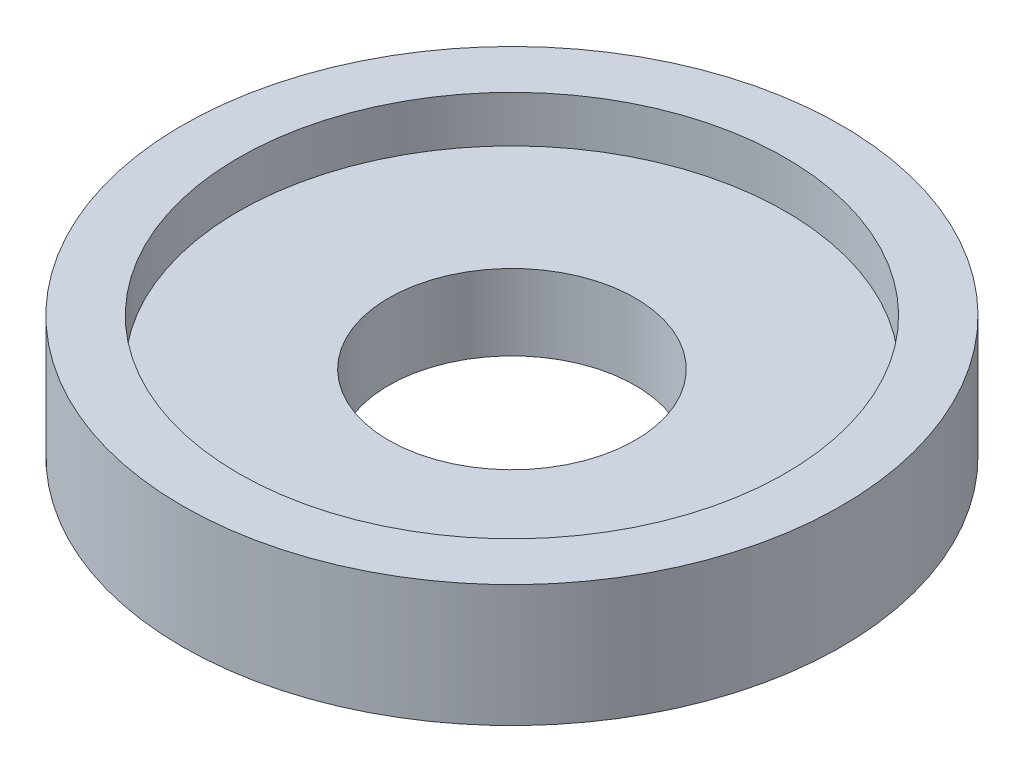
ISO-10303-21;
HEADER;
FILE_DESCRIPTION(('STEP AP214'),'2;1');
FILE_NAME('part.step','',(''),(''),'','','');
FILE_SCHEMA(('AUTOMOTIVE_DESIGN { 1 0 10303 214 1 1 1 1 }'));
ENDSEC;
DATA;
#1=APPLICATION_CONTEXT('core data for automotive mechanical design processes');
#2=APPLICATION_PROTOCOL_DEFINITION('international standard','automotive_design',2000,#1);
#3=PRODUCT_CONTEXT('',#1,'mechanical');
#4=PRODUCT('Part','Part','',(#3));
#5=PRODUCT_RELATED_PRODUCT_CATEGORY('part','',(#4));
#6=PRODUCT_DEFINITION_FORMATION('','',#4);
#7=PRODUCT_DEFINITION_CONTEXT('part definition',#1,'design');
#8=PRODUCT_DEFINITION('design','',#6,#7);
#9=PRODUCT_DEFINITION_SHAPE('','',#8);
#10=(LENGTH_UNIT() NAMED_UNIT(*) SI_UNIT(.MILLI.,.METRE.));
#11=(NAMED_UNIT(*) PLANE_ANGLE_UNIT() SI_UNIT($,.RADIAN.));
#12=(NAMED_UNIT(*) SI_UNIT($,.STERADIAN.) SOLID_ANGLE_UNIT());
#13=UNCERTAINTY_MEASURE_WITH_UNIT(LENGTH_MEASURE(1.E-05),#10,'distance_accuracy_value','');
#14=(GEOMETRIC_REPRESENTATION_CONTEXT(3) GLOBAL_UNCERTAINTY_ASSIGNED_CONTEXT((#13)) GLOBAL_UNIT_ASSIGNED_CONTEXT((#10,
#11,#12)) REPRESENTATION_CONTEXT('',''));
#15=CARTESIAN_POINT('',(0.,0.,0.));
#16=DIRECTION('',(0.,0.,1.));
#17=DIRECTION('',(1.,0.,0.));
#18=AXIS2_PLACEMENT_3D('',#15,#16,#17);
#19=CARTESIAN_POINT('',(0.,5.,0.));
#20=DIRECTION('',(0.,-1.,0.));
#21=DIRECTION('',(0.,0.,-1.));
#22=AXIS2_PLACEMENT_3D('',#19,#20,#21);
#23=CYLINDRICAL_SURFACE('',#22,5.05);
#24=CARTESIAN_POINT('',(0.,0.,0.));
#25=DIRECTION('',(0.,1.,0.));
#26=DIRECTION('',(0.,0.,1.));
#27=AXIS2_PLACEMENT_3D('',#24,#25,#26);
#28=CIRCLE('',#27,5.05);
#29=CARTESIAN_POINT('',(0.,0.,5.05));
#30=VERTEX_POINT('',#29);
#31=EDGE_CURVE('E52',#30,#30,#28,.T.);
#32=ORIENTED_EDGE('',*,*,#31,.F.);
#33=EDGE_LOOP('',(#32));
#34=FACE_BOUND('',#33,.T.);
#35=CARTESIAN_POINT('',(0.,3.1,0.));
#36=DIRECTION('',(0.,1.,0.));
#37=DIRECTION('',(0.,0.,1.));
#38=AXIS2_PLACEMENT_3D('',#35,#36,#37);
#39=CIRCLE('',#38,5.05);
#40=CARTESIAN_POINT('',(0.,3.1,5.05));
#41=VERTEX_POINT('',#40);
#42=EDGE_CURVE('E41',#41,#41,#39,.T.);
#43=ORIENTED_EDGE('',*,*,#42,.T.);
#44=EDGE_LOOP('',(#43));
#45=FACE_BOUND('',#44,.T.);
#46=ADVANCED_FACE('F37',(#34,#45),#23,.F.);
#47=CARTESIAN_POINT('',(0.,5.,0.));
#48=DIRECTION('',(0.,1.,0.));
#49=DIRECTION('',(0.,0.,1.));
#50=AXIS2_PLACEMENT_3D('',#47,#48,#49);
#51=PLANE('',#50);
#52=CARTESIAN_POINT('',(0.,5.,0.));
#53=DIRECTION('',(0.,1.,0.));
#54=DIRECTION('',(0.,0.,1.));
#55=AXIS2_PLACEMENT_3D('',#52,#53,#54);
#56=CIRCLE('',#55,11.2);
#57=CARTESIAN_POINT('',(0.,5.,11.2));
#58=VERTEX_POINT('',#57);
#59=EDGE_CURVE('E57',#58,#58,#56,.T.);
#60=ORIENTED_EDGE('',*,*,#59,.F.);
#61=EDGE_LOOP('',(#60));
#62=FACE_BOUND('',#61,.T.);
#63=CARTESIAN_POINT('',(0.,5.,0.));
#64=DIRECTION('',(0.,1.,0.));
#65=DIRECTION('',(0.,0.,1.));
#66=AXIS2_PLACEMENT_3D('',#63,#64,#65);
#67=CIRCLE('',#66,13.5);
#68=CARTESIAN_POINT('',(0.,5.,13.5));
#69=VERTEX_POINT('',#68);
#70=EDGE_CURVE('E10',#69,#69,#67,.T.);
#71=ORIENTED_EDGE('',*,*,#70,.T.);
#72=EDGE_LOOP('',(#71));
#73=FACE_BOUND('',#72,.T.);
#74=ADVANCED_FACE('F81',(#62,#73),#51,.T.);
#75=CARTESIAN_POINT('',(0.,0.,0.));
#76=DIRECTION('',(0.,1.,0.));
#77=DIRECTION('',(0.,0.,1.));
#78=AXIS2_PLACEMENT_3D('',#75,#76,#77);
#79=PLANE('',#78);
#80=CARTESIAN_POINT('',(0.,0.,0.));
#81=DIRECTION('',(0.,1.,0.));
#82=DIRECTION('',(0.,0.,1.));
#83=AXIS2_PLACEMENT_3D('',#80,#81,#82);
#84=CIRCLE('',#83,13.5);
#85=CARTESIAN_POINT('',(0.,0.,13.5));
#86=VERTEX_POINT('',#85);
#87=EDGE_CURVE('E46',#86,#86,#84,.T.);
#88=ORIENTED_EDGE('',*,*,#87,.F.);
#89=EDGE_LOOP('',(#88));
#90=FACE_BOUND('',#89,.T.);
#91=ORIENTED_EDGE('',*,*,#31,.T.);
#92=EDGE_LOOP('',(#91));
#93=FACE_BOUND('',#92,.T.);
#94=ADVANCED_FACE('F87',(#90,#93),#79,.F.);
#95=CARTESIAN_POINT('',(0.,5.,0.));
#96=DIRECTION('',(0.,-1.,0.));
#97=DIRECTION('',(0.,0.,-1.));
#98=AXIS2_PLACEMENT_3D('',#95,#96,#97);
#99=CYLINDRICAL_SURFACE('',#98,13.5);
#100=ORIENTED_EDGE('',*,*,#70,.F.);
#101=EDGE_LOOP('',(#100));
#102=FACE_BOUND('',#101,.T.);
#103=ORIENTED_EDGE('',*,*,#87,.T.);
#104=EDGE_LOOP('',(#103));
#105=FACE_BOUND('',#104,.T.);
#106=ADVANCED_FACE('F39',(#102,#105),#99,.T.);
#107=CARTESIAN_POINT('',(0.,3.1,0.));
#108=DIRECTION('',(0.,1.,0.));
#109=DIRECTION('',(0.,0.,1.));
#110=AXIS2_PLACEMENT_3D('',#107,#108,#109);
#111=CYLINDRICAL_SURFACE('',#110,11.2);
#112=CARTESIAN_POINT('',(0.,3.1,0.));
#113=DIRECTION('',(0.,1.,0.));
#114=DIRECTION('',(0.,0.,1.));
#115=AXIS2_PLACEMENT_3D('',#112,#113,#114);
#116=CIRCLE('',#115,11.2);
#117=CARTESIAN_POINT('',(0.,3.1,11.2));
#118=VERTEX_POINT('',#117);
#119=EDGE_CURVE('E61',#118,#118,#116,.T.);
#120=CARTESIAN_POINT('',(0.,3.1,11.2));
#121=CARTESIAN_POINT('',(0.,3.11979166666667,11.2));
#122=CARTESIAN_POINT('',(0.,3.13958333333333,11.2));
#123=CARTESIAN_POINT('',(0.,3.17916666666667,11.2));
#124=CARTESIAN_POINT('',(0.,3.19895833333333,11.2));
#125=CARTESIAN_POINT('',(0.,3.23854166666667,11.2));
#126=CARTESIAN_POINT('',(0.,3.25833333333333,11.2));
#127=CARTESIAN_POINT('',(0.,3.29791666666667,11.2));
#128=CARTESIAN_POINT('',(0.,3.31770833333333,11.2));
#129=CARTESIAN_POINT('',(0.,3.35729166666667,11.2));
#130=CARTESIAN_POINT('',(0.,3.37708333333333,11.2));
#131=CARTESIAN_POINT('',(0.,3.41666666666667,11.2));
#132=CARTESIAN_POINT('',(0.,3.43645833333333,11.2));
#133=CARTESIAN_POINT('',(0.,3.47604166666667,11.2));
#134=CARTESIAN_POINT('',(0.,3.49583333333333,11.2));
#135=CARTESIAN_POINT('',(0.,3.53541666666667,11.2));
#136=CARTESIAN_POINT('',(0.,3.55520833333333,11.2));
#137=CARTESIAN_POINT('',(0.,3.59479166666667,11.2));
#138=CARTESIAN_POINT('',(0.,3.61458333333333,11.2));
#139=CARTESIAN_POINT('',(0.,3.65416666666667,11.2));
#140=CARTESIAN_POINT('',(0.,3.67395833333333,11.2));
#141=CARTESIAN_POINT('',(0.,3.71354166666667,11.2));
#142=CARTESIAN_POINT('',(0.,3.73333333333333,11.2));
#143=CARTESIAN_POINT('',(0.,3.77291666666667,11.2));
#144=CARTESIAN_POINT('',(0.,3.79270833333333,11.2));
#145=CARTESIAN_POINT('',(0.,3.83229166666667,11.2));
#146=CARTESIAN_POINT('',(0.,3.85208333333333,11.2));
#147=CARTESIAN_POINT('',(0.,3.89166666666667,11.2));
#148=CARTESIAN_POINT('',(0.,3.91145833333333,11.2));
#149=CARTESIAN_POINT('',(0.,3.95104166666667,11.2));
#150=CARTESIAN_POINT('',(0.,3.97083333333333,11.2));
#151=CARTESIAN_POINT('',(0.,4.01041666666667,11.2));
#152=CARTESIAN_POINT('',(0.,4.03020833333333,11.2));
#153=CARTESIAN_POINT('',(0.,4.06979166666667,11.2));
#154=CARTESIAN_POINT('',(0.,4.08958333333333,11.2));
#155=CARTESIAN_POINT('',(0.,4.12916666666667,11.2));
#156=CARTESIAN_POINT('',(0.,4.14895833333333,11.2));
#157=CARTESIAN_POINT('',(0.,4.18854166666667,11.2));
#158=CARTESIAN_POINT('',(0.,4.20833333333333,11.2));
#159=CARTESIAN_POINT('',(0.,4.24791666666667,11.2));
#160=CARTESIAN_POINT('',(0.,4.26770833333333,11.2));
#161=CARTESIAN_POINT('',(0.,4.30729166666667,11.2));
#162=CARTESIAN_POINT('',(0.,4.32708333333333,11.2));
#163=CARTESIAN_POINT('',(0.,4.36666666666667,11.2));
#164=CARTESIAN_POINT('',(0.,4.38645833333333,11.2));
#165=CARTESIAN_POINT('',(0.,4.42604166666667,11.2));
#166=CARTESIAN_POINT('',(0.,4.44583333333333,11.2));
#167=CARTESIAN_POINT('',(0.,4.48541666666667,11.2));
#168=CARTESIAN_POINT('',(0.,4.50520833333333,11.2));
#169=CARTESIAN_POINT('',(0.,4.54479166666667,11.2));
#170=CARTESIAN_POINT('',(0.,4.56458333333333,11.2));
#171=CARTESIAN_POINT('',(0.,4.60416666666667,11.2));
#172=CARTESIAN_POINT('',(0.,4.62395833333333,11.2));
#173=CARTESIAN_POINT('',(0.,4.66354166666667,11.2));
#174=CARTESIAN_POINT('',(0.,4.68333333333333,11.2));
#175=CARTESIAN_POINT('',(0.,4.72291666666667,11.2));
#176=CARTESIAN_POINT('',(0.,4.74270833333333,11.2));
#177=CARTESIAN_POINT('',(0.,4.78229166666667,11.2));
#178=CARTESIAN_POINT('',(0.,4.80208333333333,11.2));
#179=CARTESIAN_POINT('',(0.,4.84166666666667,11.2));
#180=CARTESIAN_POINT('',(0.,4.86145833333333,11.2));
#181=CARTESIAN_POINT('',(0.,4.90104166666667,11.2));
#182=CARTESIAN_POINT('',(0.,4.92083333333333,11.2));
#183=CARTESIAN_POINT('',(0.,4.96041666666667,11.2));
#184=CARTESIAN_POINT('',(0.,4.98020833333333,11.2));
#185=CARTESIAN_POINT('',(0.,5.,11.2));
#186=B_SPLINE_CURVE_WITH_KNOTS('',3,(#120,#121,#122,#123,#124,#125,#126,#127,#128,#129,#130,
#131,#132,#133,#134,#135,#136,#137,#138,#139,#140,#141,#142,#143,#144,#145,#146,#147,#148,#149,
#150,#151,#152,#153,#154,#155,#156,#157,#158,#159,#160,#161,#162,#163,#164,#165,#166,#167,#168,
#169,#170,#171,#172,#173,#174,#175,#176,#177,#178,#179,#180,#181,#182,#183,#184,#185),
.UNSPECIFIED.,.F.,.F.,(4,2,2,2,2,2,2,2,2,2,2,2,2,2,2,2,2,2,2,2,2,2,2,2,2,2,2,2,2,2,2,2,4),(0.,
0.0593750000000004,0.11875,0.178125,0.2375,0.296875,0.35625,0.415625,0.475,0.534375,0.59375,
0.653125,0.7125,0.771875,0.83125,0.890625,0.95,1.009375,1.06875,1.128125,1.1875,1.246875,
1.30625,1.365625,1.425,1.484375,1.54375,1.603125,1.6625,1.721875,1.78125,1.840625,1.9),.UNSPECIFIED.);
#187=EDGE_CURVE('BSEAM73',#118,#58,#186,.T.);
#188=ORIENTED_EDGE('',*,*,#119,.F.);
#189=ORIENTED_EDGE('',*,*,#59,.T.);
#190=ORIENTED_EDGE('',*,*,#187,.T.);
#191=ORIENTED_EDGE('',*,*,#187,.F.);
#192=EDGE_LOOP('',(#188,#190,#189,#191));
#193=FACE_BOUND('',#192,.T.);
#194=ADVANCED_FACE('F73',(#193),#111,.F.);
#195=CARTESIAN_POINT('',(0.,3.1,0.));
#196=DIRECTION('',(0.,1.,0.));
#197=DIRECTION('',(0.,0.,1.));
#198=AXIS2_PLACEMENT_3D('',#195,#196,#197);
#199=PLANE('',#198);
#200=ORIENTED_EDGE('',*,*,#42,.F.);
#201=EDGE_LOOP('',(#200));
#202=FACE_BOUND('',#201,.T.);
#203=ORIENTED_EDGE('',*,*,#119,.T.);
#204=EDGE_LOOP('',(#203));
#205=FACE_BOUND('',#204,.T.);
#206=ADVANCED_FACE('F71',(#202,#205),#199,.T.);
#207=CLOSED_SHELL('',(#46,#74,#94,#106,#194,#206));
#208=MANIFOLD_SOLID_BREP('B2',#207);
#209=ADVANCED_BREP_SHAPE_REPRESENTATION('',(#18,#208),#14);
#210=SHAPE_DEFINITION_REPRESENTATION(#9,#209);
ENDSEC;
END-ISO-10303-21;
